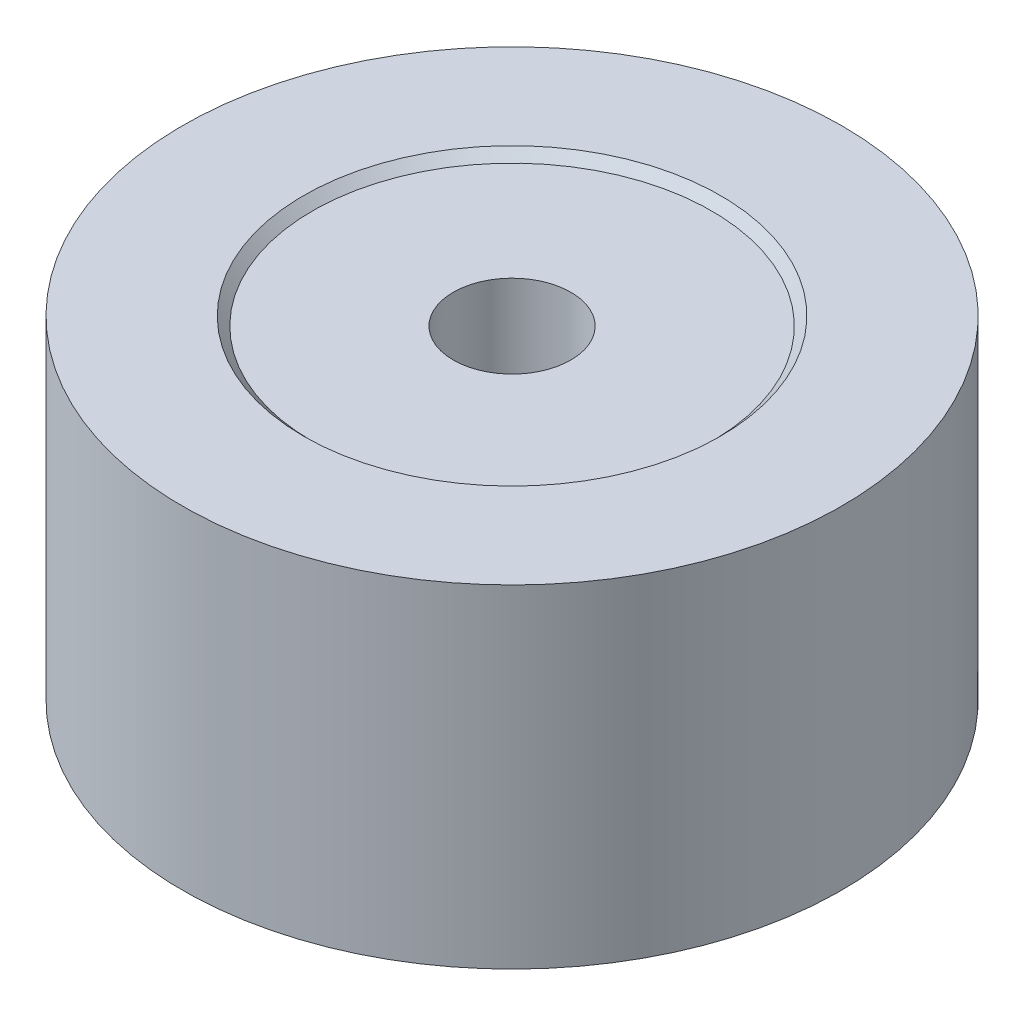
ISO-10303-21;
HEADER;
FILE_DESCRIPTION(('STEP AP214'),'2;1');
FILE_NAME('part.step','',(''),(''),'','','');
FILE_SCHEMA(('AUTOMOTIVE_DESIGN { 1 0 10303 214 1 1 1 1 }'));
ENDSEC;
DATA;
#1=APPLICATION_CONTEXT('core data for automotive mechanical design processes');
#2=APPLICATION_PROTOCOL_DEFINITION('international standard','automotive_design',2000,#1);
#3=PRODUCT_CONTEXT('',#1,'mechanical');
#4=PRODUCT('Part','Part','',(#3));
#5=PRODUCT_RELATED_PRODUCT_CATEGORY('part','',(#4));
#6=PRODUCT_DEFINITION_FORMATION('','',#4);
#7=PRODUCT_DEFINITION_CONTEXT('part definition',#1,'design');
#8=PRODUCT_DEFINITION('design','',#6,#7);
#9=PRODUCT_DEFINITION_SHAPE('','',#8);
#10=(LENGTH_UNIT() NAMED_UNIT(*) SI_UNIT(.MILLI.,.METRE.));
#11=(NAMED_UNIT(*) PLANE_ANGLE_UNIT() SI_UNIT($,.RADIAN.));
#12=(NAMED_UNIT(*) SI_UNIT($,.STERADIAN.) SOLID_ANGLE_UNIT());
#13=UNCERTAINTY_MEASURE_WITH_UNIT(LENGTH_MEASURE(1.E-05),#10,'distance_accuracy_value','');
#14=(GEOMETRIC_REPRESENTATION_CONTEXT(3) GLOBAL_UNCERTAINTY_ASSIGNED_CONTEXT((#13)) GLOBAL_UNIT_ASSIGNED_CONTEXT((#10,
#11,#12)) REPRESENTATION_CONTEXT('',''));
#15=CARTESIAN_POINT('',(0.,0.,0.));
#16=DIRECTION('',(0.,0.,1.));
#17=DIRECTION('',(1.,0.,0.));
#18=AXIS2_PLACEMENT_3D('',#15,#16,#17);
#19=CARTESIAN_POINT('',(-15.0991102408966,4.1307275842506,-1.30990509438789));
#20=DIRECTION('',(0.,1.,0.));
#21=DIRECTION('',(0.,0.,1.));
#22=AXIS2_PLACEMENT_3D('',#19,#20,#21);
#23=PLANE('',#22);
#24=CARTESIAN_POINT('',(-15.0991102408966,4.1307275842506,-1.30990509438789));
#25=DIRECTION('',(0.,1.,0.));
#26=DIRECTION('',(0.,0.,1.));
#27=AXIS2_PLACEMENT_3D('',#24,#25,#26);
#28=CIRCLE('',#27,18.8722);
#29=CARTESIAN_POINT('',(-15.0991102408966,4.1307275842506,-20.1821050943879));
#30=VERTEX_POINT('',#29);
#31=EDGE_CURVE('E38',#30,#30,#28,.T.);
#32=ORIENTED_EDGE('',*,*,#31,.F.);
#33=EDGE_LOOP('',(#32));
#34=FACE_BOUND('',#33,.T.);
#35=CARTESIAN_POINT('',(-15.0991102408966,4.1307275842506,-1.30990509438789));
#36=DIRECTION('',(0.,1.,0.));
#37=DIRECTION('',(0.,0.,1.));
#38=AXIS2_PLACEMENT_3D('',#35,#36,#37);
#39=CIRCLE('',#38,11.938);
#40=CARTESIAN_POINT('',(-15.0991102408966,4.1307275842506,10.6280949056121));
#41=VERTEX_POINT('',#40);
#42=EDGE_CURVE('E52',#41,#41,#39,.F.);
#43=ORIENTED_EDGE('',*,*,#42,.F.);
#44=EDGE_LOOP('',(#43));
#45=FACE_BOUND('',#44,.T.);
#46=ADVANCED_FACE('F22',(#34,#45),#23,.F.);
#47=CARTESIAN_POINT('',(-15.0991102408966,23.1807275842506,-1.30990509438789));
#48=DIRECTION('',(0.,-1.,0.));
#49=DIRECTION('',(0.,0.,-1.));
#50=AXIS2_PLACEMENT_3D('',#47,#48,#49);
#51=CYLINDRICAL_SURFACE('',#50,18.8722);
#52=CARTESIAN_POINT('',(-15.0991102408966,23.1807275842506,-1.30990509438789));
#53=DIRECTION('',(0.,1.,0.));
#54=DIRECTION('',(0.,0.,1.));
#55=AXIS2_PLACEMENT_3D('',#52,#53,#54);
#56=CIRCLE('',#55,18.8722);
#57=CARTESIAN_POINT('',(-15.0991102408966,23.1807275842506,-20.1821050943879));
#58=VERTEX_POINT('',#57);
#59=EDGE_CURVE('E31',#58,#58,#56,.T.);
#60=CARTESIAN_POINT('',(-15.0991102408966,23.1807275842506,-20.1821050943879));
#61=CARTESIAN_POINT('',(-15.0991102408966,22.9822900842506,-20.1821050943879));
#62=CARTESIAN_POINT('',(-15.0991102408966,22.7838525842506,-20.1821050943879));
#63=CARTESIAN_POINT('',(-15.0991102408966,22.3869775842506,-20.1821050943879));
#64=CARTESIAN_POINT('',(-15.0991102408966,22.1885400842506,-20.1821050943879));
#65=CARTESIAN_POINT('',(-15.0991102408966,21.7916650842506,-20.1821050943879));
#66=CARTESIAN_POINT('',(-15.0991102408966,21.5932275842506,-20.1821050943879));
#67=CARTESIAN_POINT('',(-15.0991102408966,21.1963525842506,-20.1821050943879));
#68=CARTESIAN_POINT('',(-15.0991102408966,20.9979150842506,-20.1821050943879));
#69=CARTESIAN_POINT('',(-15.0991102408966,20.6010400842506,-20.1821050943879));
#70=CARTESIAN_POINT('',(-15.0991102408966,20.4026025842506,-20.1821050943879));
#71=CARTESIAN_POINT('',(-15.0991102408966,20.0057275842506,-20.1821050943879));
#72=CARTESIAN_POINT('',(-15.0991102408966,19.8072900842506,-20.1821050943879));
#73=CARTESIAN_POINT('',(-15.0991102408966,19.4104150842506,-20.1821050943879));
#74=CARTESIAN_POINT('',(-15.0991102408966,19.2119775842506,-20.1821050943879));
#75=CARTESIAN_POINT('',(-15.0991102408966,18.8151025842506,-20.1821050943879));
#76=CARTESIAN_POINT('',(-15.0991102408966,18.6166650842506,-20.1821050943879));
#77=CARTESIAN_POINT('',(-15.0991102408966,18.2197900842506,-20.1821050943879));
#78=CARTESIAN_POINT('',(-15.0991102408966,18.0213525842506,-20.1821050943879));
#79=CARTESIAN_POINT('',(-15.0991102408966,17.6244775842506,-20.1821050943879));
#80=CARTESIAN_POINT('',(-15.0991102408966,17.4260400842506,-20.1821050943879));
#81=CARTESIAN_POINT('',(-15.0991102408966,17.0291650842506,-20.1821050943879));
#82=CARTESIAN_POINT('',(-15.0991102408966,16.8307275842506,-20.1821050943879));
#83=CARTESIAN_POINT('',(-15.0991102408966,16.4338525842506,-20.1821050943879));
#84=CARTESIAN_POINT('',(-15.0991102408966,16.2354150842506,-20.1821050943879));
#85=CARTESIAN_POINT('',(-15.0991102408966,15.8385400842506,-20.1821050943879));
#86=CARTESIAN_POINT('',(-15.0991102408966,15.6401025842506,-20.1821050943879));
#87=CARTESIAN_POINT('',(-15.0991102408966,15.2432275842506,-20.1821050943879));
#88=CARTESIAN_POINT('',(-15.0991102408966,15.0447900842506,-20.1821050943879));
#89=CARTESIAN_POINT('',(-15.0991102408966,14.6479150842506,-20.1821050943879));
#90=CARTESIAN_POINT('',(-15.0991102408966,14.4494775842506,-20.1821050943879));
#91=CARTESIAN_POINT('',(-15.0991102408966,14.0526025842506,-20.1821050943879));
#92=CARTESIAN_POINT('',(-15.0991102408966,13.8541650842506,-20.1821050943879));
#93=CARTESIAN_POINT('',(-15.0991102408966,13.4572900842506,-20.1821050943879));
#94=CARTESIAN_POINT('',(-15.0991102408966,13.2588525842506,-20.1821050943879));
#95=CARTESIAN_POINT('',(-15.0991102408966,12.8619775842506,-20.1821050943879));
#96=CARTESIAN_POINT('',(-15.0991102408966,12.6635400842506,-20.1821050943879));
#97=CARTESIAN_POINT('',(-15.0991102408966,12.2666650842506,-20.1821050943879));
#98=CARTESIAN_POINT('',(-15.0991102408966,12.0682275842506,-20.1821050943879));
#99=CARTESIAN_POINT('',(-15.0991102408966,11.6713525842506,-20.1821050943879));
#100=CARTESIAN_POINT('',(-15.0991102408966,11.4729150842506,-20.1821050943879));
#101=CARTESIAN_POINT('',(-15.0991102408966,11.0760400842506,-20.1821050943879));
#102=CARTESIAN_POINT('',(-15.0991102408966,10.8776025842506,-20.1821050943879));
#103=CARTESIAN_POINT('',(-15.0991102408966,10.4807275842506,-20.1821050943879));
#104=CARTESIAN_POINT('',(-15.0991102408966,10.2822900842506,-20.1821050943879));
#105=CARTESIAN_POINT('',(-15.0991102408966,9.88541508425059,-20.1821050943879));
#106=CARTESIAN_POINT('',(-15.0991102408966,9.6869775842506,-20.1821050943879));
#107=CARTESIAN_POINT('',(-15.0991102408966,9.29010258425059,-20.1821050943879));
#108=CARTESIAN_POINT('',(-15.0991102408966,9.09166508425059,-20.1821050943879));
#109=CARTESIAN_POINT('',(-15.0991102408966,8.69479008425059,-20.1821050943879));
#110=CARTESIAN_POINT('',(-15.0991102408966,8.49635258425059,-20.1821050943879));
#111=CARTESIAN_POINT('',(-15.0991102408966,8.09947758425059,-20.1821050943879));
#112=CARTESIAN_POINT('',(-15.0991102408966,7.90104008425059,-20.1821050943879));
#113=CARTESIAN_POINT('',(-15.0991102408966,7.5041650842506,-20.1821050943879));
#114=CARTESIAN_POINT('',(-15.0991102408966,7.3057275842506,-20.1821050943879));
#115=CARTESIAN_POINT('',(-15.0991102408966,6.9088525842506,-20.1821050943879));
#116=CARTESIAN_POINT('',(-15.0991102408966,6.7104150842506,-20.1821050943879));
#117=CARTESIAN_POINT('',(-15.0991102408966,6.3135400842506,-20.1821050943879));
#118=CARTESIAN_POINT('',(-15.0991102408966,6.1151025842506,-20.1821050943879));
#119=CARTESIAN_POINT('',(-15.0991102408966,5.7182275842506,-20.1821050943879));
#120=CARTESIAN_POINT('',(-15.0991102408966,5.5197900842506,-20.1821050943879));
#121=CARTESIAN_POINT('',(-15.0991102408966,5.1229150842506,-20.1821050943879));
#122=CARTESIAN_POINT('',(-15.0991102408966,4.9244775842506,-20.1821050943879));
#123=CARTESIAN_POINT('',(-15.0991102408966,4.5276025842506,-20.1821050943879));
#124=CARTESIAN_POINT('',(-15.0991102408966,4.3291650842506,-20.1821050943879));
#125=CARTESIAN_POINT('',(-15.0991102408966,4.1307275842506,-20.1821050943879));
#126=B_SPLINE_CURVE_WITH_KNOTS('',3,(#60,#61,#62,#63,#64,#65,#66,#67,#68,#69,#70,#71,#72,#73,
#74,#75,#76,#77,#78,#79,#80,#81,#82,#83,#84,#85,#86,#87,#88,#89,#90,#91,#92,#93,#94,#95,#96,#97,
#98,#99,#100,#101,#102,#103,#104,#105,#106,#107,#108,#109,#110,#111,#112,#113,#114,#115,#116,
#117,#118,#119,#120,#121,#122,#123,#124,#125),.UNSPECIFIED.,.F.,.F.,(4,2,2,2,2,2,2,2,2,2,2,2,2,
2,2,2,2,2,2,2,2,2,2,2,2,2,2,2,2,2,2,2,4),(0.,0.5953125,1.190625,1.7859375,2.38125,2.9765625,
3.571875,4.1671875,4.7625,5.3578125,5.953125,6.5484375,7.14375,7.7390625,8.334375,8.9296875,
9.525,10.1203125,10.715625,11.3109375,11.90625,12.5015625,13.096875,13.6921875,14.2875,
14.8828125,15.478125,16.0734375,16.66875,17.2640625,17.859375,18.4546875,19.05),.UNSPECIFIED.);
#127=EDGE_CURVE('BSEAM85',#58,#30,#126,.T.);
#128=ORIENTED_EDGE('',*,*,#59,.F.);
#129=ORIENTED_EDGE('',*,*,#31,.T.);
#130=ORIENTED_EDGE('',*,*,#127,.T.);
#131=ORIENTED_EDGE('',*,*,#127,.F.);
#132=EDGE_LOOP('',(#128,#130,#129,#131));
#133=FACE_BOUND('',#132,.T.);
#134=ADVANCED_FACE('F85',(#133),#51,.T.);
#135=CARTESIAN_POINT('',(-15.0991102408966,23.1807275842506,-1.30990509438789));
#136=DIRECTION('',(0.,1.,0.));
#137=DIRECTION('',(0.,0.,1.));
#138=AXIS2_PLACEMENT_3D('',#135,#136,#137);
#139=PLANE('',#138);
#140=CARTESIAN_POINT('',(-15.0991102408966,23.1807275842506,-1.30990509438789));
#141=DIRECTION('',(0.,1.,0.));
#142=DIRECTION('',(0.,0.,1.));
#143=AXIS2_PLACEMENT_3D('',#140,#141,#142);
#144=CIRCLE('',#143,11.938);
#145=CARTESIAN_POINT('',(-15.0991102408966,23.1807275842506,10.6280949056121));
#146=VERTEX_POINT('',#145);
#147=EDGE_CURVE('E12',#146,#146,#144,.F.);
#148=ORIENTED_EDGE('',*,*,#147,.T.);
#149=EDGE_LOOP('',(#148));
#150=FACE_BOUND('',#149,.T.);
#151=ORIENTED_EDGE('',*,*,#59,.T.);
#152=EDGE_LOOP('',(#151));
#153=FACE_BOUND('',#152,.T.);
#154=ADVANCED_FACE('F91',(#150,#153),#139,.T.);
#155=CARTESIAN_POINT('',(-15.0991102408966,22.6727275842506,-1.30990509438789));
#156=DIRECTION('',(0.,1.,0.));
#157=DIRECTION('',(0.,0.,1.));
#158=AXIS2_PLACEMENT_3D('',#155,#156,#157);
#159=PLANE('',#158);
#160=CARTESIAN_POINT('',(-15.0991102408966,22.6727275842506,-1.30990509438789));
#161=DIRECTION('',(0.,1.,0.));
#162=DIRECTION('',(0.,0.,1.));
#163=AXIS2_PLACEMENT_3D('',#160,#161,#162);
#164=CIRCLE('',#163,3.3655);
#165=CARTESIAN_POINT('',(-15.0991102408966,22.6727275842506,2.05559490561211));
#166=VERTEX_POINT('',#165);
#167=EDGE_CURVE('E56',#166,#166,#164,.T.);
#168=ORIENTED_EDGE('',*,*,#167,.F.);
#169=EDGE_LOOP('',(#168));
#170=FACE_BOUND('',#169,.T.);
#171=CARTESIAN_POINT('',(-15.0991102408966,22.6727275842506,-1.30990509438789));
#172=DIRECTION('',(0.,1.,0.));
#173=DIRECTION('',(0.,0.,1.));
#174=AXIS2_PLACEMENT_3D('',#171,#172,#173);
#175=CIRCLE('',#174,11.43);
#176=CARTESIAN_POINT('',(-15.0991102408966,22.6727275842506,10.1200949056121));
#177=VERTEX_POINT('',#176);
#178=EDGE_CURVE('E43',#177,#177,#175,.T.);
#179=ORIENTED_EDGE('',*,*,#178,.T.);
#180=EDGE_LOOP('',(#179));
#181=FACE_BOUND('',#180,.T.);
#182=ADVANCED_FACE('F98',(#170,#181),#159,.T.);
#183=CARTESIAN_POINT('',(-15.0991102408966,22.6727275842506,-1.30990509438789));
#184=DIRECTION('',(0.,1.,0.));
#185=DIRECTION('',(0.,0.,1.));
#186=AXIS2_PLACEMENT_3D('',#183,#184,#185);
#187=CONICAL_SURFACE('',#186,11.43,0.785398163397452);
#188=ORIENTED_EDGE('',*,*,#147,.F.);
#189=EDGE_LOOP('',(#188));
#190=FACE_BOUND('',#189,.T.);
#191=ORIENTED_EDGE('',*,*,#178,.F.);
#192=EDGE_LOOP('',(#191));
#193=FACE_BOUND('',#192,.T.);
#194=ADVANCED_FACE('F24',(#190,#193),#187,.F.);
#195=CARTESIAN_POINT('',(-15.0991102408966,4.6387275842506,-1.30990509438789));
#196=DIRECTION('',(0.,-1.,0.));
#197=DIRECTION('',(0.,0.,1.));
#198=AXIS2_PLACEMENT_3D('',#195,#196,#197);
#199=PLANE('',#198);
#200=CARTESIAN_POINT('',(-15.0991102408966,4.6387275842506,-1.30990509438789));
#201=DIRECTION('',(0.,-1.,0.));
#202=DIRECTION('',(0.,0.,-1.));
#203=AXIS2_PLACEMENT_3D('',#200,#201,#202);
#204=CIRCLE('',#203,3.3655);
#205=CARTESIAN_POINT('',(-15.0991102408966,4.6387275842506,-4.67540509438789));
#206=VERTEX_POINT('',#205);
#207=EDGE_CURVE('E26',#206,#206,#204,.T.);
#208=ORIENTED_EDGE('',*,*,#207,.F.);
#209=EDGE_LOOP('',(#208));
#210=FACE_BOUND('',#209,.T.);
#211=CARTESIAN_POINT('',(-15.0991102408966,4.6387275842506,-1.30990509438789));
#212=DIRECTION('',(0.,1.,0.));
#213=DIRECTION('',(0.,0.,1.));
#214=AXIS2_PLACEMENT_3D('',#211,#212,#213);
#215=CIRCLE('',#214,11.43);
#216=CARTESIAN_POINT('',(-15.0991102408966,4.6387275842506,10.1200949056121));
#217=VERTEX_POINT('',#216);
#218=EDGE_CURVE('E48',#217,#217,#215,.T.);
#219=ORIENTED_EDGE('',*,*,#218,.F.);
#220=EDGE_LOOP('',(#219));
#221=FACE_BOUND('',#220,.T.);
#222=ADVANCED_FACE('F69',(#210,#221),#199,.T.);
#223=CARTESIAN_POINT('',(-15.0991102408966,4.63872758425059,-1.30990509438789));
#224=DIRECTION('',(0.,-1.,0.));
#225=DIRECTION('',(0.,0.,1.));
#226=AXIS2_PLACEMENT_3D('',#223,#224,#225);
#227=CONICAL_SURFACE('',#226,11.43,0.785398163397452);
#228=ORIENTED_EDGE('',*,*,#42,.T.);
#229=EDGE_LOOP('',(#228));
#230=FACE_BOUND('',#229,.T.);
#231=ORIENTED_EDGE('',*,*,#218,.T.);
#232=EDGE_LOOP('',(#231));
#233=FACE_BOUND('',#232,.T.);
#234=ADVANCED_FACE('F72',(#230,#233),#227,.F.);
#235=CARTESIAN_POINT('',(-15.0991102408966,4.1307275842506,-1.30990509438789));
#236=DIRECTION('',(0.,1.,0.));
#237=DIRECTION('',(0.,0.,1.));
#238=AXIS2_PLACEMENT_3D('',#235,#236,#237);
#239=CYLINDRICAL_SURFACE('',#238,3.3655);
#240=ORIENTED_EDGE('',*,*,#207,.T.);
#241=EDGE_LOOP('',(#240));
#242=FACE_BOUND('',#241,.T.);
#243=ORIENTED_EDGE('',*,*,#167,.T.);
#244=EDGE_LOOP('',(#243));
#245=FACE_BOUND('',#244,.T.);
#246=ADVANCED_FACE('F67',(#242,#245),#239,.F.);
#247=CLOSED_SHELL('',(#46,#134,#154,#182,#194,#222,#234,#246));
#248=MANIFOLD_SOLID_BREP('B1',#247);
#249=ADVANCED_BREP_SHAPE_REPRESENTATION('',(#18,#248),#14);
#250=SHAPE_DEFINITION_REPRESENTATION(#9,#249);
ENDSEC;
END-ISO-10303-21;
